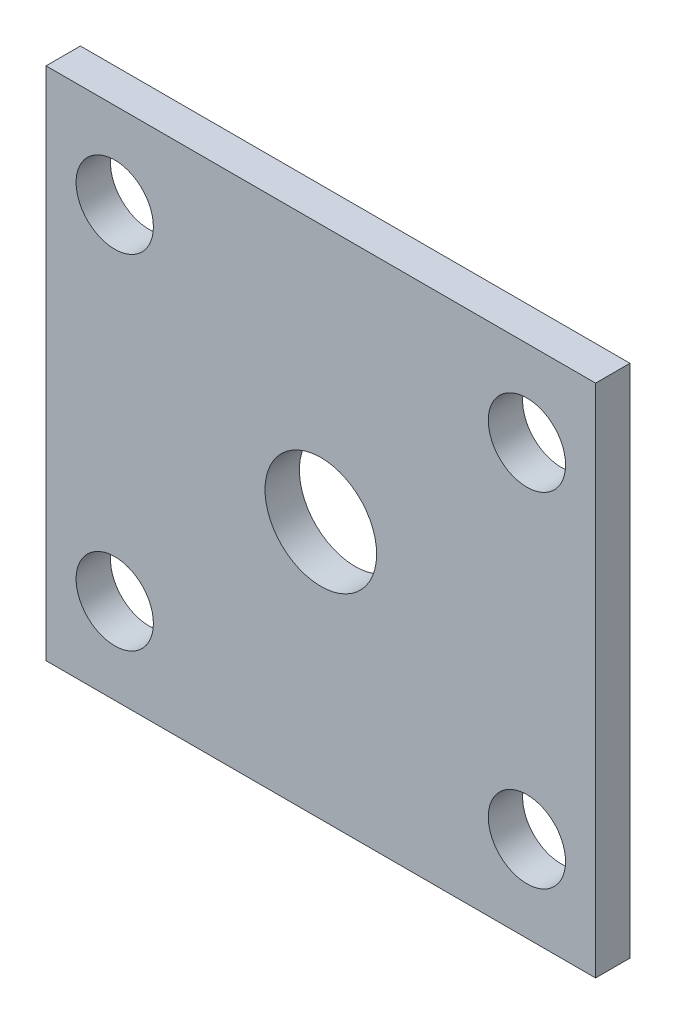
ISO-10303-21;
HEADER;
FILE_DESCRIPTION(('STEP AP214'),'2;1');
FILE_NAME('part.step','',(''),(''),'','','');
FILE_SCHEMA(('AUTOMOTIVE_DESIGN { 1 0 10303 214 1 1 1 1 }'));
ENDSEC;
DATA;
#1=APPLICATION_CONTEXT('core data for automotive mechanical design processes');
#2=APPLICATION_PROTOCOL_DEFINITION('international standard','automotive_design',2000,#1);
#3=PRODUCT_CONTEXT('',#1,'mechanical');
#4=PRODUCT('Part','Part','',(#3));
#5=PRODUCT_RELATED_PRODUCT_CATEGORY('part','',(#4));
#6=PRODUCT_DEFINITION_FORMATION('','',#4);
#7=PRODUCT_DEFINITION_CONTEXT('part definition',#1,'design');
#8=PRODUCT_DEFINITION('design','',#6,#7);
#9=PRODUCT_DEFINITION_SHAPE('','',#8);
#10=(LENGTH_UNIT() NAMED_UNIT(*) SI_UNIT(.MILLI.,.METRE.));
#11=(NAMED_UNIT(*) PLANE_ANGLE_UNIT() SI_UNIT($,.RADIAN.));
#12=(NAMED_UNIT(*) SI_UNIT($,.STERADIAN.) SOLID_ANGLE_UNIT());
#13=UNCERTAINTY_MEASURE_WITH_UNIT(LENGTH_MEASURE(1.E-05),#10,'distance_accuracy_value','');
#14=(GEOMETRIC_REPRESENTATION_CONTEXT(3) GLOBAL_UNCERTAINTY_ASSIGNED_CONTEXT((#13)) GLOBAL_UNIT_ASSIGNED_CONTEXT((#10,
#11,#12)) REPRESENTATION_CONTEXT('',''));
#15=CARTESIAN_POINT('',(0.,0.,0.));
#16=DIRECTION('',(0.,0.,1.));
#17=DIRECTION('',(1.,0.,0.));
#18=AXIS2_PLACEMENT_3D('',#15,#16,#17);
#19=CARTESIAN_POINT('',(12.,10.,-1.));
#20=DIRECTION('',(0.,0.,1.));
#21=DIRECTION('',(1.,0.,0.));
#22=AXIS2_PLACEMENT_3D('',#19,#20,#21);
#23=CYLINDRICAL_SURFACE('',#22,2.25);
#24=CARTESIAN_POINT('',(12.,10.,2.));
#25=DIRECTION('',(0.,0.,1.));
#26=DIRECTION('',(1.,0.,0.));
#27=AXIS2_PLACEMENT_3D('',#24,#25,#26);
#28=CIRCLE('',#27,2.25);
#29=CARTESIAN_POINT('',(14.25,10.,2.));
#30=VERTEX_POINT('',#29);
#31=EDGE_CURVE('E119',#30,#30,#28,.T.);
#32=ORIENTED_EDGE('',*,*,#31,.T.);
#33=EDGE_LOOP('',(#32));
#34=FACE_BOUND('',#33,.T.);
#35=CARTESIAN_POINT('',(12.,10.,0.));
#36=DIRECTION('',(0.,0.,1.));
#37=DIRECTION('',(1.,0.,0.));
#38=AXIS2_PLACEMENT_3D('',#35,#36,#37);
#39=CIRCLE('',#38,2.25);
#40=CARTESIAN_POINT('',(14.25,10.,0.));
#41=VERTEX_POINT('',#40);
#42=EDGE_CURVE('E10',#41,#41,#39,.T.);
#43=ORIENTED_EDGE('',*,*,#42,.F.);
#44=EDGE_LOOP('',(#43));
#45=FACE_BOUND('',#44,.T.);
#46=ADVANCED_FACE('F16',(#34,#45),#23,.F.);
#47=CARTESIAN_POINT('',(-12.,10.,-1.));
#48=DIRECTION('',(0.,0.,1.));
#49=DIRECTION('',(1.,0.,0.));
#50=AXIS2_PLACEMENT_3D('',#47,#48,#49);
#51=CYLINDRICAL_SURFACE('',#50,2.25);
#52=CARTESIAN_POINT('',(-12.,10.,2.));
#53=DIRECTION('',(0.,0.,1.));
#54=DIRECTION('',(1.,0.,0.));
#55=AXIS2_PLACEMENT_3D('',#52,#53,#54);
#56=CIRCLE('',#55,2.25);
#57=CARTESIAN_POINT('',(-9.75,10.,2.));
#58=VERTEX_POINT('',#57);
#59=EDGE_CURVE('E123',#58,#58,#56,.T.);
#60=ORIENTED_EDGE('',*,*,#59,.T.);
#61=EDGE_LOOP('',(#60));
#62=FACE_BOUND('',#61,.T.);
#63=CARTESIAN_POINT('',(-12.,10.,0.));
#64=DIRECTION('',(0.,0.,1.));
#65=DIRECTION('',(1.,0.,0.));
#66=AXIS2_PLACEMENT_3D('',#63,#64,#65);
#67=CIRCLE('',#66,2.25);
#68=CARTESIAN_POINT('',(-9.75,10.,0.));
#69=VERTEX_POINT('',#68);
#70=EDGE_CURVE('E24',#69,#69,#67,.T.);
#71=ORIENTED_EDGE('',*,*,#70,.F.);
#72=EDGE_LOOP('',(#71));
#73=FACE_BOUND('',#72,.T.);
#74=ADVANCED_FACE('F160',(#62,#73),#51,.F.);
#75=CARTESIAN_POINT('',(0.,0.,-1.));
#76=DIRECTION('',(0.,0.,1.));
#77=DIRECTION('',(1.,0.,0.));
#78=AXIS2_PLACEMENT_3D('',#75,#76,#77);
#79=CYLINDRICAL_SURFACE('',#78,3.25);
#80=CARTESIAN_POINT('',(0.,0.,2.));
#81=DIRECTION('',(0.,0.,1.));
#82=DIRECTION('',(1.,0.,0.));
#83=AXIS2_PLACEMENT_3D('',#80,#81,#82);
#84=CIRCLE('',#83,3.25);
#85=CARTESIAN_POINT('',(3.25,0.,2.));
#86=VERTEX_POINT('',#85);
#87=EDGE_CURVE('E134',#86,#86,#84,.T.);
#88=ORIENTED_EDGE('',*,*,#87,.T.);
#89=EDGE_LOOP('',(#88));
#90=FACE_BOUND('',#89,.T.);
#91=CARTESIAN_POINT('',(0.,0.,0.));
#92=DIRECTION('',(0.,0.,1.));
#93=DIRECTION('',(1.,0.,0.));
#94=AXIS2_PLACEMENT_3D('',#91,#92,#93);
#95=CIRCLE('',#94,3.25);
#96=CARTESIAN_POINT('',(3.25,0.,0.));
#97=VERTEX_POINT('',#96);
#98=EDGE_CURVE('E149',#97,#97,#95,.T.);
#99=ORIENTED_EDGE('',*,*,#98,.F.);
#100=EDGE_LOOP('',(#99));
#101=FACE_BOUND('',#100,.T.);
#102=ADVANCED_FACE('F162',(#90,#101),#79,.F.);
#103=CARTESIAN_POINT('',(12.,-10.,-1.));
#104=DIRECTION('',(0.,0.,1.));
#105=DIRECTION('',(1.,0.,0.));
#106=AXIS2_PLACEMENT_3D('',#103,#104,#105);
#107=CYLINDRICAL_SURFACE('',#106,2.25);
#108=CARTESIAN_POINT('',(12.,-10.,2.));
#109=DIRECTION('',(0.,0.,1.));
#110=DIRECTION('',(1.,0.,0.));
#111=AXIS2_PLACEMENT_3D('',#108,#109,#110);
#112=CIRCLE('',#111,2.25);
#113=CARTESIAN_POINT('',(14.25,-10.,2.));
#114=VERTEX_POINT('',#113);
#115=EDGE_CURVE('E116',#114,#114,#112,.T.);
#116=ORIENTED_EDGE('',*,*,#115,.T.);
#117=EDGE_LOOP('',(#116));
#118=FACE_BOUND('',#117,.T.);
#119=CARTESIAN_POINT('',(12.,-10.,0.));
#120=DIRECTION('',(0.,0.,1.));
#121=DIRECTION('',(1.,0.,0.));
#122=AXIS2_PLACEMENT_3D('',#119,#120,#121);
#123=CIRCLE('',#122,2.25);
#124=CARTESIAN_POINT('',(14.25,-10.,0.));
#125=VERTEX_POINT('',#124);
#126=EDGE_CURVE('E130',#125,#125,#123,.T.);
#127=ORIENTED_EDGE('',*,*,#126,.F.);
#128=EDGE_LOOP('',(#127));
#129=FACE_BOUND('',#128,.T.);
#130=ADVANCED_FACE('F170',(#118,#129),#107,.F.);
#131=CARTESIAN_POINT('',(-12.,-10.,-1.));
#132=DIRECTION('',(0.,0.,1.));
#133=DIRECTION('',(1.,0.,0.));
#134=AXIS2_PLACEMENT_3D('',#131,#132,#133);
#135=CYLINDRICAL_SURFACE('',#134,2.25);
#136=CARTESIAN_POINT('',(-12.,-10.,2.));
#137=DIRECTION('',(0.,0.,1.));
#138=DIRECTION('',(1.,0.,0.));
#139=AXIS2_PLACEMENT_3D('',#136,#137,#138);
#140=CIRCLE('',#139,2.25);
#141=CARTESIAN_POINT('',(-9.75,-10.,2.));
#142=VERTEX_POINT('',#141);
#143=EDGE_CURVE('E112',#142,#142,#140,.T.);
#144=ORIENTED_EDGE('',*,*,#143,.T.);
#145=EDGE_LOOP('',(#144));
#146=FACE_BOUND('',#145,.T.);
#147=CARTESIAN_POINT('',(-12.,-10.,0.));
#148=DIRECTION('',(0.,0.,1.));
#149=DIRECTION('',(1.,0.,0.));
#150=AXIS2_PLACEMENT_3D('',#147,#148,#149);
#151=CIRCLE('',#150,2.25);
#152=CARTESIAN_POINT('',(-9.75,-10.,0.));
#153=VERTEX_POINT('',#152);
#154=EDGE_CURVE('E126',#153,#153,#151,.T.);
#155=ORIENTED_EDGE('',*,*,#154,.F.);
#156=EDGE_LOOP('',(#155));
#157=FACE_BOUND('',#156,.T.);
#158=ADVANCED_FACE('F184',(#146,#157),#135,.F.);
#159=CARTESIAN_POINT('',(16.,-15.,0.));
#160=DIRECTION('',(1.,0.,0.));
#161=DIRECTION('',(0.,1.,0.));
#162=AXIS2_PLACEMENT_3D('',#159,#160,#161);
#163=PLANE('',#162);
#164=DIRECTION('',(0.,0.,1.));
#165=VECTOR('',#164,1.);
#166=CARTESIAN_POINT('',(16.,-15.,0.));
#167=LINE('',#166,#165);
#168=CARTESIAN_POINT('',(16.,-15.,0.));
#169=VERTEX_POINT('',#168);
#170=CARTESIAN_POINT('',(16.,-15.,2.));
#171=VERTEX_POINT('',#170);
#172=EDGE_CURVE('E76',#169,#171,#167,.T.);
#173=ORIENTED_EDGE('',*,*,#172,.F.);
#174=DIRECTION('',(0.,1.,0.));
#175=VECTOR('',#174,1.);
#176=CARTESIAN_POINT('',(16.,-15.,0.));
#177=LINE('',#176,#175);
#178=CARTESIAN_POINT('',(16.,15.,0.));
#179=VERTEX_POINT('',#178);
#180=EDGE_CURVE('E36',#169,#179,#177,.T.);
#181=ORIENTED_EDGE('',*,*,#180,.T.);
#182=DIRECTION('',(0.,0.,1.));
#183=VECTOR('',#182,1.);
#184=CARTESIAN_POINT('',(16.,15.,0.));
#185=LINE('',#184,#183);
#186=CARTESIAN_POINT('',(16.,15.,2.));
#187=VERTEX_POINT('',#186);
#188=EDGE_CURVE('E42',#179,#187,#185,.T.);
#189=ORIENTED_EDGE('',*,*,#188,.T.);
#190=DIRECTION('',(0.,1.,0.));
#191=VECTOR('',#190,1.);
#192=CARTESIAN_POINT('',(16.,-15.,2.));
#193=LINE('',#192,#191);
#194=EDGE_CURVE('E111',#171,#187,#193,.T.);
#195=ORIENTED_EDGE('',*,*,#194,.F.);
#196=EDGE_LOOP('',(#173,#181,#189,#195));
#197=FACE_BOUND('',#196,.T.);
#198=ADVANCED_FACE('F180',(#197),#163,.T.);
#199=CARTESIAN_POINT('',(-16.,-15.,0.));
#200=DIRECTION('',(0.,0.,1.));
#201=DIRECTION('',(1.,0.,0.));
#202=AXIS2_PLACEMENT_3D('',#199,#200,#201);
#203=PLANE('',#202);
#204=ORIENTED_EDGE('',*,*,#42,.T.);
#205=EDGE_LOOP('',(#204));
#206=FACE_BOUND('',#205,.T.);
#207=ORIENTED_EDGE('',*,*,#70,.T.);
#208=EDGE_LOOP('',(#207));
#209=FACE_BOUND('',#208,.T.);
#210=ORIENTED_EDGE('',*,*,#98,.T.);
#211=EDGE_LOOP('',(#210));
#212=FACE_BOUND('',#211,.T.);
#213=ORIENTED_EDGE('',*,*,#126,.T.);
#214=EDGE_LOOP('',(#213));
#215=FACE_BOUND('',#214,.T.);
#216=ORIENTED_EDGE('',*,*,#154,.T.);
#217=EDGE_LOOP('',(#216));
#218=FACE_BOUND('',#217,.T.);
#219=DIRECTION('',(1.,0.,0.));
#220=VECTOR('',#219,1.);
#221=CARTESIAN_POINT('',(-16.,15.,0.));
#222=LINE('',#221,#220);
#223=CARTESIAN_POINT('',(-16.,15.,0.));
#224=VERTEX_POINT('',#223);
#225=EDGE_CURVE('E104',#224,#179,#222,.T.);
#226=ORIENTED_EDGE('',*,*,#225,.T.);
#227=ORIENTED_EDGE('',*,*,#180,.F.);
#228=DIRECTION('',(1.,0.,0.));
#229=VECTOR('',#228,1.);
#230=CARTESIAN_POINT('',(-16.,-15.,0.));
#231=LINE('',#230,#229);
#232=CARTESIAN_POINT('',(-16.,-15.,0.));
#233=VERTEX_POINT('',#232);
#234=EDGE_CURVE('E81',#233,#169,#231,.T.);
#235=ORIENTED_EDGE('',*,*,#234,.F.);
#236=DIRECTION('',(0.,1.,0.));
#237=VECTOR('',#236,1.);
#238=CARTESIAN_POINT('',(-16.,-15.,0.));
#239=LINE('',#238,#237);
#240=EDGE_CURVE('E89',#233,#224,#239,.T.);
#241=ORIENTED_EDGE('',*,*,#240,.T.);
#242=EDGE_LOOP('',(#226,#227,#235,#241));
#243=FACE_BOUND('',#242,.T.);
#244=ADVANCED_FACE('F157',(#206,#209,#212,#215,#218,#243),#203,.F.);
#245=CARTESIAN_POINT('',(-16.,15.,0.));
#246=DIRECTION('',(0.,1.,0.));
#247=DIRECTION('',(1.,0.,0.));
#248=AXIS2_PLACEMENT_3D('',#245,#246,#247);
#249=PLANE('',#248);
#250=ORIENTED_EDGE('',*,*,#225,.F.);
#251=DIRECTION('',(0.,0.,1.));
#252=VECTOR('',#251,1.);
#253=CARTESIAN_POINT('',(-16.,15.,0.));
#254=LINE('',#253,#252);
#255=CARTESIAN_POINT('',(-16.,15.,2.));
#256=VERTEX_POINT('',#255);
#257=EDGE_CURVE('E96',#224,#256,#254,.T.);
#258=ORIENTED_EDGE('',*,*,#257,.T.);
#259=DIRECTION('',(1.,0.,0.));
#260=VECTOR('',#259,1.);
#261=CARTESIAN_POINT('',(-16.,15.,2.));
#262=LINE('',#261,#260);
#263=EDGE_CURVE('E93',#256,#187,#262,.T.);
#264=ORIENTED_EDGE('',*,*,#263,.T.);
#265=ORIENTED_EDGE('',*,*,#188,.F.);
#266=EDGE_LOOP('',(#250,#258,#264,#265));
#267=FACE_BOUND('',#266,.T.);
#268=ADVANCED_FACE('F176',(#267),#249,.T.);
#269=CARTESIAN_POINT('',(-16.,-15.,2.));
#270=DIRECTION('',(0.,0.,1.));
#271=DIRECTION('',(1.,0.,0.));
#272=AXIS2_PLACEMENT_3D('',#269,#270,#271);
#273=PLANE('',#272);
#274=ORIENTED_EDGE('',*,*,#31,.F.);
#275=EDGE_LOOP('',(#274));
#276=FACE_BOUND('',#275,.T.);
#277=ORIENTED_EDGE('',*,*,#59,.F.);
#278=EDGE_LOOP('',(#277));
#279=FACE_BOUND('',#278,.T.);
#280=ORIENTED_EDGE('',*,*,#87,.F.);
#281=EDGE_LOOP('',(#280));
#282=FACE_BOUND('',#281,.T.);
#283=ORIENTED_EDGE('',*,*,#115,.F.);
#284=EDGE_LOOP('',(#283));
#285=FACE_BOUND('',#284,.T.);
#286=ORIENTED_EDGE('',*,*,#143,.F.);
#287=EDGE_LOOP('',(#286));
#288=FACE_BOUND('',#287,.T.);
#289=DIRECTION('',(0.,1.,0.));
#290=VECTOR('',#289,1.);
#291=CARTESIAN_POINT('',(-16.,-15.,2.));
#292=LINE('',#291,#290);
#293=CARTESIAN_POINT('',(-16.,-15.,2.));
#294=VERTEX_POINT('',#293);
#295=EDGE_CURVE('E87',#294,#256,#292,.T.);
#296=ORIENTED_EDGE('',*,*,#295,.F.);
#297=DIRECTION('',(1.,0.,0.));
#298=VECTOR('',#297,1.);
#299=CARTESIAN_POINT('',(-16.,-15.,2.));
#300=LINE('',#299,#298);
#301=EDGE_CURVE('E70',#294,#171,#300,.T.);
#302=ORIENTED_EDGE('',*,*,#301,.T.);
#303=ORIENTED_EDGE('',*,*,#194,.T.);
#304=ORIENTED_EDGE('',*,*,#263,.F.);
#305=EDGE_LOOP('',(#296,#302,#303,#304));
#306=FACE_BOUND('',#305,.T.);
#307=ADVANCED_FACE('F92',(#276,#279,#282,#285,#288,#306),#273,.T.);
#308=CARTESIAN_POINT('',(-16.,-15.,0.));
#309=DIRECTION('',(0.,1.,0.));
#310=DIRECTION('',(1.,0.,0.));
#311=AXIS2_PLACEMENT_3D('',#308,#309,#310);
#312=PLANE('',#311);
#313=ORIENTED_EDGE('',*,*,#172,.T.);
#314=ORIENTED_EDGE('',*,*,#301,.F.);
#315=DIRECTION('',(0.,0.,1.));
#316=VECTOR('',#315,1.);
#317=CARTESIAN_POINT('',(-16.,-15.,0.));
#318=LINE('',#317,#316);
#319=EDGE_CURVE('E74',#233,#294,#318,.T.);
#320=ORIENTED_EDGE('',*,*,#319,.F.);
#321=ORIENTED_EDGE('',*,*,#234,.T.);
#322=EDGE_LOOP('',(#313,#314,#320,#321));
#323=FACE_BOUND('',#322,.T.);
#324=ADVANCED_FACE('F72',(#323),#312,.F.);
#325=CARTESIAN_POINT('',(-16.,-15.,0.));
#326=DIRECTION('',(1.,0.,0.));
#327=DIRECTION('',(0.,1.,0.));
#328=AXIS2_PLACEMENT_3D('',#325,#326,#327);
#329=PLANE('',#328);
#330=ORIENTED_EDGE('',*,*,#295,.T.);
#331=ORIENTED_EDGE('',*,*,#257,.F.);
#332=ORIENTED_EDGE('',*,*,#240,.F.);
#333=ORIENTED_EDGE('',*,*,#319,.T.);
#334=EDGE_LOOP('',(#330,#331,#332,#333));
#335=FACE_BOUND('',#334,.T.);
#336=ADVANCED_FACE('F85',(#335),#329,.F.);
#337=CLOSED_SHELL('',(#46,#74,#102,#130,#158,#198,#244,#268,#307,#324,#336));
#338=MANIFOLD_SOLID_BREP('B1',#337);
#339=ADVANCED_BREP_SHAPE_REPRESENTATION('',(#18,#338),#14);
#340=SHAPE_DEFINITION_REPRESENTATION(#9,#339);
ENDSEC;
END-ISO-10303-21;
